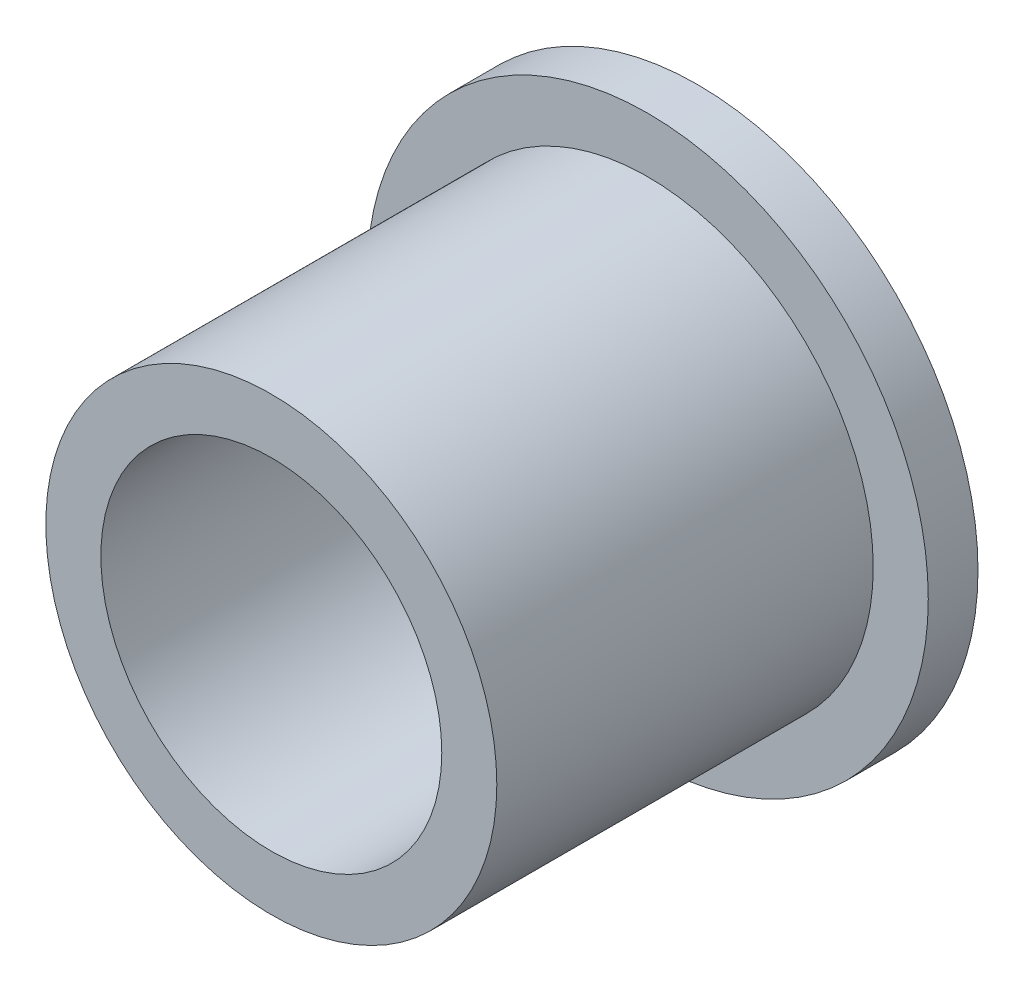
ISO-10303-21;
HEADER;
FILE_DESCRIPTION(('STEP AP214'),'2;1');
FILE_NAME('part.step','',(''),(''),'','','');
FILE_SCHEMA(('AUTOMOTIVE_DESIGN { 1 0 10303 214 1 1 1 1 }'));
ENDSEC;
DATA;
#1=APPLICATION_CONTEXT('core data for automotive mechanical design processes');
#2=APPLICATION_PROTOCOL_DEFINITION('international standard','automotive_design',2000,#1);
#3=PRODUCT_CONTEXT('',#1,'mechanical');
#4=PRODUCT('Part','Part','',(#3));
#5=PRODUCT_RELATED_PRODUCT_CATEGORY('part','',(#4));
#6=PRODUCT_DEFINITION_FORMATION('','',#4);
#7=PRODUCT_DEFINITION_CONTEXT('part definition',#1,'design');
#8=PRODUCT_DEFINITION('design','',#6,#7);
#9=PRODUCT_DEFINITION_SHAPE('','',#8);
#10=(LENGTH_UNIT() NAMED_UNIT(*) SI_UNIT(.MILLI.,.METRE.));
#11=(NAMED_UNIT(*) PLANE_ANGLE_UNIT() SI_UNIT($,.RADIAN.));
#12=(NAMED_UNIT(*) SI_UNIT($,.STERADIAN.) SOLID_ANGLE_UNIT());
#13=UNCERTAINTY_MEASURE_WITH_UNIT(LENGTH_MEASURE(1.E-05),#10,'distance_accuracy_value','');
#14=(GEOMETRIC_REPRESENTATION_CONTEXT(3) GLOBAL_UNCERTAINTY_ASSIGNED_CONTEXT((#13)) GLOBAL_UNIT_ASSIGNED_CONTEXT((#10,
#11,#12)) REPRESENTATION_CONTEXT('',''));
#15=CARTESIAN_POINT('',(0.,0.,0.));
#16=DIRECTION('',(0.,0.,1.));
#17=DIRECTION('',(1.,0.,0.));
#18=AXIS2_PLACEMENT_3D('',#15,#16,#17);
#19=CARTESIAN_POINT('',(0.,0.,12.));
#20=DIRECTION('',(0.,0.,1.));
#21=DIRECTION('',(1.,0.,0.));
#22=AXIS2_PLACEMENT_3D('',#19,#20,#21);
#23=PLANE('',#22);
#24=CARTESIAN_POINT('',(0.,0.,12.));
#25=DIRECTION('',(0.,0.,1.));
#26=DIRECTION('',(1.,0.,0.));
#27=AXIS2_PLACEMENT_3D('',#24,#25,#26);
#28=CIRCLE('',#27,4.8);
#29=CARTESIAN_POINT('',(4.8,0.,12.));
#30=VERTEX_POINT('',#29);
#31=EDGE_CURVE('E50',#30,#30,#28,.T.);
#32=ORIENTED_EDGE('',*,*,#31,.F.);
#33=EDGE_LOOP('',(#32));
#34=FACE_BOUND('',#33,.T.);
#35=CARTESIAN_POINT('',(0.,0.,12.));
#36=DIRECTION('',(0.,0.,1.));
#37=DIRECTION('',(1.,0.,0.));
#38=AXIS2_PLACEMENT_3D('',#35,#36,#37);
#39=CIRCLE('',#38,6.35);
#40=CARTESIAN_POINT('',(6.35,0.,12.));
#41=VERTEX_POINT('',#40);
#42=EDGE_CURVE('E56',#41,#41,#39,.T.);
#43=ORIENTED_EDGE('',*,*,#42,.T.);
#44=EDGE_LOOP('',(#43));
#45=FACE_BOUND('',#44,.T.);
#46=ADVANCED_FACE('F39',(#34,#45),#23,.T.);
#47=CARTESIAN_POINT('',(0.,0.,12.));
#48=DIRECTION('',(0.,0.,-1.));
#49=DIRECTION('',(-1.,0.,0.));
#50=AXIS2_PLACEMENT_3D('',#47,#48,#49);
#51=CYLINDRICAL_SURFACE('',#50,7.9);
#52=CARTESIAN_POINT('',(0.,0.,0.));
#53=DIRECTION('',(0.,0.,1.));
#54=DIRECTION('',(1.,0.,0.));
#55=AXIS2_PLACEMENT_3D('',#52,#53,#54);
#56=CIRCLE('',#55,7.9);
#57=CARTESIAN_POINT('',(7.9,0.,0.));
#58=VERTEX_POINT('',#57);
#59=EDGE_CURVE('E11',#58,#58,#56,.T.);
#60=ORIENTED_EDGE('',*,*,#59,.T.);
#61=EDGE_LOOP('',(#60));
#62=FACE_BOUND('',#61,.T.);
#63=CARTESIAN_POINT('',(0.,0.,1.4));
#64=DIRECTION('',(0.,0.,1.));
#65=DIRECTION('',(1.,0.,0.));
#66=AXIS2_PLACEMENT_3D('',#63,#64,#65);
#67=CIRCLE('',#66,7.9);
#68=CARTESIAN_POINT('',(7.9,0.,1.4));
#69=VERTEX_POINT('',#68);
#70=EDGE_CURVE('E43',#69,#69,#67,.T.);
#71=ORIENTED_EDGE('',*,*,#70,.F.);
#72=EDGE_LOOP('',(#71));
#73=FACE_BOUND('',#72,.T.);
#74=ADVANCED_FACE('F41',(#62,#73),#51,.T.);
#75=CARTESIAN_POINT('',(0.,0.,0.));
#76=DIRECTION('',(0.,0.,1.));
#77=DIRECTION('',(1.,0.,0.));
#78=AXIS2_PLACEMENT_3D('',#75,#76,#77);
#79=PLANE('',#78);
#80=ORIENTED_EDGE('',*,*,#59,.F.);
#81=EDGE_LOOP('',(#80));
#82=FACE_BOUND('',#81,.T.);
#83=CARTESIAN_POINT('',(0.,0.,0.));
#84=DIRECTION('',(0.,0.,1.));
#85=DIRECTION('',(1.,0.,0.));
#86=AXIS2_PLACEMENT_3D('',#83,#84,#85);
#87=CIRCLE('',#86,4.8);
#88=CARTESIAN_POINT('',(4.8,0.,0.));
#89=VERTEX_POINT('',#88);
#90=EDGE_CURVE('E51',#89,#89,#87,.T.);
#91=ORIENTED_EDGE('',*,*,#90,.T.);
#92=EDGE_LOOP('',(#91));
#93=FACE_BOUND('',#92,.T.);
#94=ADVANCED_FACE('F83',(#82,#93),#79,.F.);
#95=CARTESIAN_POINT('',(0.,0.,12.));
#96=DIRECTION('',(0.,0.,-1.));
#97=DIRECTION('',(-1.,0.,0.));
#98=AXIS2_PLACEMENT_3D('',#95,#96,#97);
#99=CYLINDRICAL_SURFACE('',#98,4.8);
#100=ORIENTED_EDGE('',*,*,#31,.T.);
#101=EDGE_LOOP('',(#100));
#102=FACE_BOUND('',#101,.T.);
#103=ORIENTED_EDGE('',*,*,#90,.F.);
#104=EDGE_LOOP('',(#103));
#105=FACE_BOUND('',#104,.T.);
#106=ADVANCED_FACE('F75',(#102,#105),#99,.F.);
#107=CARTESIAN_POINT('',(0.,0.,1.4));
#108=DIRECTION('',(0.,0.,1.));
#109=DIRECTION('',(1.,0.,0.));
#110=AXIS2_PLACEMENT_3D('',#107,#108,#109);
#111=PLANE('',#110);
#112=CARTESIAN_POINT('',(0.,0.,1.4));
#113=DIRECTION('',(0.,0.,1.));
#114=DIRECTION('',(1.,0.,0.));
#115=AXIS2_PLACEMENT_3D('',#112,#113,#114);
#116=CIRCLE('',#115,6.35);
#117=CARTESIAN_POINT('',(6.35,0.,1.4));
#118=VERTEX_POINT('',#117);
#119=EDGE_CURVE('E57',#118,#118,#116,.F.);
#120=ORIENTED_EDGE('',*,*,#119,.T.);
#121=EDGE_LOOP('',(#120));
#122=FACE_BOUND('',#121,.T.);
#123=ORIENTED_EDGE('',*,*,#70,.T.);
#124=EDGE_LOOP('',(#123));
#125=FACE_BOUND('',#124,.T.);
#126=ADVANCED_FACE('F66',(#122,#125),#111,.T.);
#127=CARTESIAN_POINT('',(0.,0.,-28.6948890662247));
#128=DIRECTION('',(0.,0.,1.));
#129=DIRECTION('',(1.,0.,0.));
#130=AXIS2_PLACEMENT_3D('',#127,#128,#129);
#131=CYLINDRICAL_SURFACE('',#130,6.35);
#132=CARTESIAN_POINT('',(6.35,0.,1.4));
#133=CARTESIAN_POINT('',(6.35,0.,1.51041666666666));
#134=CARTESIAN_POINT('',(6.35,0.,1.62083333333333));
#135=CARTESIAN_POINT('',(6.35,0.,1.84166666666666));
#136=CARTESIAN_POINT('',(6.35,0.,1.95208333333333));
#137=CARTESIAN_POINT('',(6.35,0.,2.17291666666667));
#138=CARTESIAN_POINT('',(6.35,0.,2.28333333333333));
#139=CARTESIAN_POINT('',(6.35,0.,2.50416666666667));
#140=CARTESIAN_POINT('',(6.35,0.,2.61458333333333));
#141=CARTESIAN_POINT('',(6.35,0.,2.83541666666666));
#142=CARTESIAN_POINT('',(6.35,0.,2.94583333333333));
#143=CARTESIAN_POINT('',(6.35,0.,3.16666666666666));
#144=CARTESIAN_POINT('',(6.35,0.,3.27708333333333));
#145=CARTESIAN_POINT('',(6.35,0.,3.49791666666666));
#146=CARTESIAN_POINT('',(6.35,0.,3.60833333333333));
#147=CARTESIAN_POINT('',(6.35,0.,3.82916666666666));
#148=CARTESIAN_POINT('',(6.35,0.,3.93958333333333));
#149=CARTESIAN_POINT('',(6.35,0.,4.16041666666666));
#150=CARTESIAN_POINT('',(6.35,0.,4.27083333333333));
#151=CARTESIAN_POINT('',(6.35,0.,4.49166666666666));
#152=CARTESIAN_POINT('',(6.35,0.,4.60208333333332));
#153=CARTESIAN_POINT('',(6.35,0.,4.82291666666666));
#154=CARTESIAN_POINT('',(6.35,0.,4.93333333333333));
#155=CARTESIAN_POINT('',(6.35,0.,5.15416666666666));
#156=CARTESIAN_POINT('',(6.35,0.,5.26458333333333));
#157=CARTESIAN_POINT('',(6.35,0.,5.48541666666666));
#158=CARTESIAN_POINT('',(6.35,0.,5.59583333333333));
#159=CARTESIAN_POINT('',(6.35,0.,5.81666666666666));
#160=CARTESIAN_POINT('',(6.35,0.,5.92708333333333));
#161=CARTESIAN_POINT('',(6.35,0.,6.14791666666666));
#162=CARTESIAN_POINT('',(6.35,0.,6.25833333333333));
#163=CARTESIAN_POINT('',(6.35,0.,6.47916666666666));
#164=CARTESIAN_POINT('',(6.35,0.,6.58958333333333));
#165=CARTESIAN_POINT('',(6.35,0.,6.81041666666666));
#166=CARTESIAN_POINT('',(6.35,0.,6.92083333333333));
#167=CARTESIAN_POINT('',(6.35,0.,7.14166666666666));
#168=CARTESIAN_POINT('',(6.35,0.,7.25208333333333));
#169=CARTESIAN_POINT('',(6.35,0.,7.47291666666666));
#170=CARTESIAN_POINT('',(6.35,0.,7.58333333333333));
#171=CARTESIAN_POINT('',(6.35,0.,7.80416666666666));
#172=CARTESIAN_POINT('',(6.35,0.,7.91458333333333));
#173=CARTESIAN_POINT('',(6.35,0.,8.13541666666666));
#174=CARTESIAN_POINT('',(6.35,0.,8.24583333333332));
#175=CARTESIAN_POINT('',(6.35,0.,8.46666666666666));
#176=CARTESIAN_POINT('',(6.35,0.,8.57708333333333));
#177=CARTESIAN_POINT('',(6.35,0.,8.79791666666666));
#178=CARTESIAN_POINT('',(6.35,0.,8.90833333333333));
#179=CARTESIAN_POINT('',(6.35,0.,9.12916666666666));
#180=CARTESIAN_POINT('',(6.35,0.,9.23958333333333));
#181=CARTESIAN_POINT('',(6.35,0.,9.46041666666666));
#182=CARTESIAN_POINT('',(6.35,0.,9.57083333333333));
#183=CARTESIAN_POINT('',(6.35,0.,9.79166666666666));
#184=CARTESIAN_POINT('',(6.35,0.,9.90208333333332));
#185=CARTESIAN_POINT('',(6.35,0.,10.1229166666667));
#186=CARTESIAN_POINT('',(6.35,0.,10.2333333333333));
#187=CARTESIAN_POINT('',(6.35,0.,10.4541666666667));
#188=CARTESIAN_POINT('',(6.35,0.,10.5645833333333));
#189=CARTESIAN_POINT('',(6.35,0.,10.7854166666667));
#190=CARTESIAN_POINT('',(6.35,0.,10.8958333333333));
#191=CARTESIAN_POINT('',(6.35,0.,11.1166666666667));
#192=CARTESIAN_POINT('',(6.35,0.,11.2270833333333));
#193=CARTESIAN_POINT('',(6.35,0.,11.4479166666667));
#194=CARTESIAN_POINT('',(6.35,0.,11.5583333333333));
#195=CARTESIAN_POINT('',(6.35,0.,11.7791666666667));
#196=CARTESIAN_POINT('',(6.35,0.,11.8895833333333));
#197=CARTESIAN_POINT('',(6.35,0.,12.));
#198=B_SPLINE_CURVE_WITH_KNOTS('',3,(#132,#133,#134,#135,#136,#137,#138,#139,#140,#141,#142,
#143,#144,#145,#146,#147,#148,#149,#150,#151,#152,#153,#154,#155,#156,#157,#158,#159,#160,#161,
#162,#163,#164,#165,#166,#167,#168,#169,#170,#171,#172,#173,#174,#175,#176,#177,#178,#179,#180,
#181,#182,#183,#184,#185,#186,#187,#188,#189,#190,#191,#192,#193,#194,#195,#196,#197),
.UNSPECIFIED.,.F.,.F.,(4,2,2,2,2,2,2,2,2,2,2,2,2,2,2,2,2,2,2,2,2,2,2,2,2,2,2,2,2,2,2,2,4),(0.,
0.331249999999998,0.6625,0.993750000000002,1.325,1.65624999999999,1.9875,2.31875,2.65,
2.98124999999999,3.31249999999999,3.64375,3.975,4.30624999999999,4.6375,4.96875,5.3,
5.63124999999999,5.96249999999999,6.29375,6.625,6.95624999999999,7.2875,7.61875,
7.94999999999999,8.28124999999999,8.61249999999999,8.94375,9.275,9.60624999999999,9.9375,
10.26875,10.6),.UNSPECIFIED.);
#199=EDGE_CURVE('BSEAM61',#118,#41,#198,.T.);
#200=ORIENTED_EDGE('',*,*,#119,.F.);
#201=ORIENTED_EDGE('',*,*,#42,.F.);
#202=ORIENTED_EDGE('',*,*,#199,.T.);
#203=ORIENTED_EDGE('',*,*,#199,.F.);
#204=EDGE_LOOP('',(#200,#202,#201,#203));
#205=FACE_BOUND('',#204,.T.);
#206=ADVANCED_FACE('F61',(#205),#131,.T.);
#207=CLOSED_SHELL('',(#46,#74,#94,#106,#126,#206));
#208=MANIFOLD_SOLID_BREP('B2',#207);
#209=ADVANCED_BREP_SHAPE_REPRESENTATION('',(#18,#208),#14);
#210=SHAPE_DEFINITION_REPRESENTATION(#9,#209);
ENDSEC;
END-ISO-10303-21;
